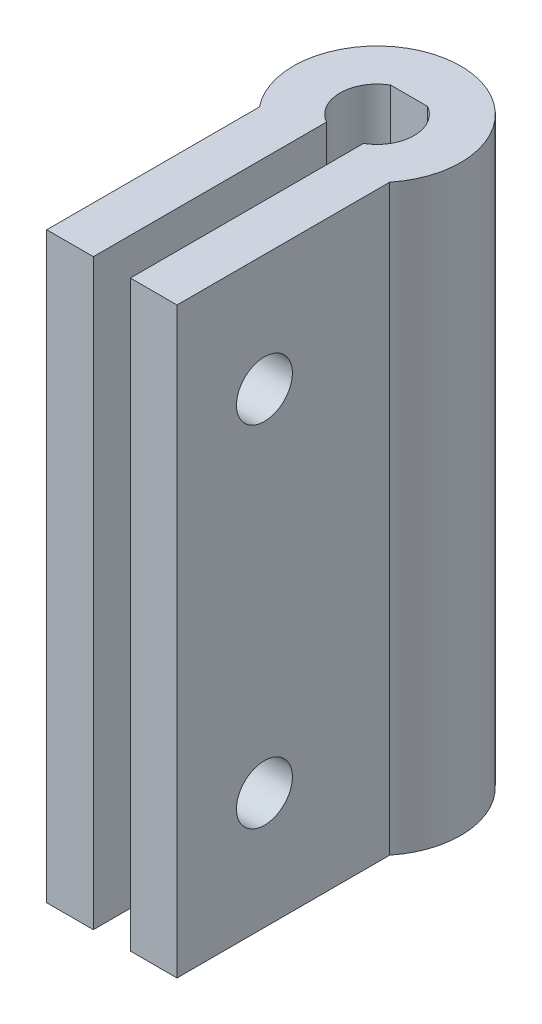
ISO-10303-21;
HEADER;
FILE_DESCRIPTION(('STEP AP214'),'2;1');
FILE_NAME('part.step','',(''),(''),'','','');
FILE_SCHEMA(('AUTOMOTIVE_DESIGN { 1 0 10303 214 1 1 1 1 }'));
ENDSEC;
DATA;
#1=APPLICATION_CONTEXT('core data for automotive mechanical design processes');
#2=APPLICATION_PROTOCOL_DEFINITION('international standard','automotive_design',2000,#1);
#3=PRODUCT_CONTEXT('',#1,'mechanical');
#4=PRODUCT('Part','Part','',(#3));
#5=PRODUCT_RELATED_PRODUCT_CATEGORY('part','',(#4));
#6=PRODUCT_DEFINITION_FORMATION('','',#4);
#7=PRODUCT_DEFINITION_CONTEXT('part definition',#1,'design');
#8=PRODUCT_DEFINITION('design','',#6,#7);
#9=PRODUCT_DEFINITION_SHAPE('','',#8);
#10=(LENGTH_UNIT() NAMED_UNIT(*) SI_UNIT(.MILLI.,.METRE.));
#11=(NAMED_UNIT(*) PLANE_ANGLE_UNIT() SI_UNIT($,.RADIAN.));
#12=(NAMED_UNIT(*) SI_UNIT($,.STERADIAN.) SOLID_ANGLE_UNIT());
#13=UNCERTAINTY_MEASURE_WITH_UNIT(LENGTH_MEASURE(1.E-05),#10,'distance_accuracy_value','');
#14=(GEOMETRIC_REPRESENTATION_CONTEXT(3) GLOBAL_UNCERTAINTY_ASSIGNED_CONTEXT((#13)) GLOBAL_UNIT_ASSIGNED_CONTEXT((#10,
#11,#12)) REPRESENTATION_CONTEXT('',''));
#15=CARTESIAN_POINT('',(0.,0.,0.));
#16=DIRECTION('',(0.,0.,1.));
#17=DIRECTION('',(1.,0.,0.));
#18=AXIS2_PLACEMENT_3D('',#15,#16,#17);
#19=CARTESIAN_POINT('',(0.,50.,0.));
#20=DIRECTION('',(0.,-1.,0.));
#21=DIRECTION('',(0.,0.,-1.));
#22=AXIS2_PLACEMENT_3D('',#19,#20,#21);
#23=CYLINDRICAL_SURFACE('',#22,3.175);
#24=CARTESIAN_POINT('',(0.,0.,0.));
#25=DIRECTION('',(0.,-1.,0.));
#26=DIRECTION('',(0.,0.,1.));
#27=AXIS2_PLACEMENT_3D('',#24,#25,#26);
#28=CIRCLE('',#27,3.175);
#29=CARTESIAN_POINT('',(1.5875,0.,-2.74963065701559));
#30=VERTEX_POINT('',#29);
#31=CARTESIAN_POINT('',(1.5875,0.,2.74963065701559));
#32=VERTEX_POINT('',#31);
#33=EDGE_CURVE('E158',#30,#32,#28,.T.);
#34=ORIENTED_EDGE('',*,*,#33,.T.);
#35=DIRECTION('',(0.,-1.,0.));
#36=VECTOR('',#35,1.);
#37=CARTESIAN_POINT('',(1.5875,50.,2.74963065701559));
#38=LINE('',#37,#36);
#39=CARTESIAN_POINT('',(1.5875,50.,2.74963065701559));
#40=VERTEX_POINT('',#39);
#41=EDGE_CURVE('E11',#40,#32,#38,.T.);
#42=ORIENTED_EDGE('',*,*,#41,.F.);
#43=CARTESIAN_POINT('',(0.,50.,0.));
#44=DIRECTION('',(0.,-1.,0.));
#45=DIRECTION('',(0.,0.,1.));
#46=AXIS2_PLACEMENT_3D('',#43,#44,#45);
#47=CIRCLE('',#46,3.175);
#48=CARTESIAN_POINT('',(1.5875,50.,-2.74963065701559));
#49=VERTEX_POINT('',#48);
#50=EDGE_CURVE('E187',#49,#40,#47,.T.);
#51=ORIENTED_EDGE('',*,*,#50,.F.);
#52=DIRECTION('',(0.,-1.,0.));
#53=VECTOR('',#52,1.);
#54=CARTESIAN_POINT('',(1.5875,50.,-2.74963065701559));
#55=LINE('',#54,#53);
#56=EDGE_CURVE('E154',#49,#30,#55,.T.);
#57=ORIENTED_EDGE('',*,*,#56,.T.);
#58=EDGE_LOOP('',(#34,#42,#51,#57));
#59=FACE_BOUND('',#58,.T.);
#60=ADVANCED_FACE('F43',(#59),#23,.F.);
#61=CARTESIAN_POINT('',(1.5875,50.,2.74963065701559));
#62=DIRECTION('',(1.,0.,0.));
#63=DIRECTION('',(0.,0.,-1.));
#64=AXIS2_PLACEMENT_3D('',#61,#62,#63);
#65=PLANE('',#64);
#66=CARTESIAN_POINT('',(1.5875,40.,15.2496306570156));
#67=DIRECTION('',(1.,0.,0.));
#68=DIRECTION('',(0.,0.,-1.));
#69=AXIS2_PLACEMENT_3D('',#66,#67,#68);
#70=CIRCLE('',#69,2.4);
#71=CARTESIAN_POINT('',(1.5875,40.,12.8496306570156));
#72=VERTEX_POINT('',#71);
#73=EDGE_CURVE('E224',#72,#72,#70,.T.);
#74=ORIENTED_EDGE('',*,*,#73,.T.);
#75=EDGE_LOOP('',(#74));
#76=FACE_BOUND('',#75,.T.);
#77=CARTESIAN_POINT('',(1.5875,10.,15.2496306570156));
#78=DIRECTION('',(1.,0.,0.));
#79=DIRECTION('',(0.,0.,-1.));
#80=AXIS2_PLACEMENT_3D('',#77,#78,#79);
#81=CIRCLE('',#80,2.4);
#82=CARTESIAN_POINT('',(1.5875,10.,12.8496306570156));
#83=VERTEX_POINT('',#82);
#84=EDGE_CURVE('E163',#83,#83,#81,.T.);
#85=ORIENTED_EDGE('',*,*,#84,.T.);
#86=EDGE_LOOP('',(#85));
#87=FACE_BOUND('',#86,.T.);
#88=DIRECTION('',(0.,0.,1.));
#89=VECTOR('',#88,1.);
#90=CARTESIAN_POINT('',(1.5875,0.,2.74963065701559));
#91=LINE('',#90,#89);
#92=CARTESIAN_POINT('',(1.5875,0.,22.7496306570156));
#93=VERTEX_POINT('',#92);
#94=EDGE_CURVE('E162',#32,#93,#91,.T.);
#95=ORIENTED_EDGE('',*,*,#94,.T.);
#96=DIRECTION('',(0.,-1.,0.));
#97=VECTOR('',#96,1.);
#98=CARTESIAN_POINT('',(1.5875,50.,22.7496306570156));
#99=LINE('',#98,#97);
#100=CARTESIAN_POINT('',(1.5875,50.,22.7496306570156));
#101=VERTEX_POINT('',#100);
#102=EDGE_CURVE('E53',#101,#93,#99,.T.);
#103=ORIENTED_EDGE('',*,*,#102,.F.);
#104=DIRECTION('',(0.,0.,1.));
#105=VECTOR('',#104,1.);
#106=CARTESIAN_POINT('',(1.5875,50.,2.74963065701559));
#107=LINE('',#106,#105);
#108=EDGE_CURVE('E111',#40,#101,#107,.T.);
#109=ORIENTED_EDGE('',*,*,#108,.F.);
#110=ORIENTED_EDGE('',*,*,#41,.T.);
#111=EDGE_LOOP('',(#95,#103,#109,#110));
#112=FACE_BOUND('',#111,.T.);
#113=ADVANCED_FACE('F281',(#76,#87,#112),#65,.F.);
#114=CARTESIAN_POINT('',(1.5875,50.,22.7496306570156));
#115=DIRECTION('',(0.,0.,-1.));
#116=DIRECTION('',(-1.,0.,0.));
#117=AXIS2_PLACEMENT_3D('',#114,#115,#116);
#118=PLANE('',#117);
#119=DIRECTION('',(1.,0.,0.));
#120=VECTOR('',#119,1.);
#121=CARTESIAN_POINT('',(1.5875,0.,22.7496306570156));
#122=LINE('',#121,#120);
#123=CARTESIAN_POINT('',(5.5875,0.,22.7496306570156));
#124=VERTEX_POINT('',#123);
#125=EDGE_CURVE('E166',#93,#124,#122,.T.);
#126=ORIENTED_EDGE('',*,*,#125,.T.);
#127=DIRECTION('',(0.,-1.,0.));
#128=VECTOR('',#127,1.);
#129=CARTESIAN_POINT('',(5.5875,50.,22.7496306570156));
#130=LINE('',#129,#128);
#131=CARTESIAN_POINT('',(5.5875,50.,22.7496306570156));
#132=VERTEX_POINT('',#131);
#133=EDGE_CURVE('E206',#132,#124,#130,.T.);
#134=ORIENTED_EDGE('',*,*,#133,.F.);
#135=DIRECTION('',(1.,0.,0.));
#136=VECTOR('',#135,1.);
#137=CARTESIAN_POINT('',(1.5875,50.,22.7496306570156));
#138=LINE('',#137,#136);
#139=EDGE_CURVE('E241',#101,#132,#138,.T.);
#140=ORIENTED_EDGE('',*,*,#139,.F.);
#141=ORIENTED_EDGE('',*,*,#102,.T.);
#142=EDGE_LOOP('',(#126,#134,#140,#141));
#143=FACE_BOUND('',#142,.T.);
#144=ADVANCED_FACE('F285',(#143),#118,.F.);
#145=CARTESIAN_POINT('',(5.5875,50.,4.50116304414759));
#146=DIRECTION('',(-1.,0.,0.));
#147=DIRECTION('',(0.,0.,1.));
#148=AXIS2_PLACEMENT_3D('',#145,#146,#147);
#149=PLANE('',#148);
#150=CARTESIAN_POINT('',(5.5875,40.,15.2496306570156));
#151=DIRECTION('',(1.,0.,0.));
#152=DIRECTION('',(0.,0.,-1.));
#153=AXIS2_PLACEMENT_3D('',#150,#151,#152);
#154=CIRCLE('',#153,2.4);
#155=CARTESIAN_POINT('',(5.5875,40.,12.8496306570156));
#156=VERTEX_POINT('',#155);
#157=EDGE_CURVE('E317',#156,#156,#154,.T.);
#158=ORIENTED_EDGE('',*,*,#157,.F.);
#159=EDGE_LOOP('',(#158));
#160=FACE_BOUND('',#159,.T.);
#161=CARTESIAN_POINT('',(5.5875,10.,15.2496306570156));
#162=DIRECTION('',(1.,0.,0.));
#163=DIRECTION('',(0.,0.,-1.));
#164=AXIS2_PLACEMENT_3D('',#161,#162,#163);
#165=CIRCLE('',#164,2.4);
#166=CARTESIAN_POINT('',(5.5875,10.,12.8496306570156));
#167=VERTEX_POINT('',#166);
#168=EDGE_CURVE('E216',#167,#167,#165,.T.);
#169=ORIENTED_EDGE('',*,*,#168,.F.);
#170=EDGE_LOOP('',(#169));
#171=FACE_BOUND('',#170,.T.);
#172=DIRECTION('',(0.,0.,-1.));
#173=VECTOR('',#172,1.);
#174=CARTESIAN_POINT('',(5.5875,0.,4.50116304414759));
#175=LINE('',#174,#173);
#176=CARTESIAN_POINT('',(5.5875,0.,4.50116304414759));
#177=VERTEX_POINT('',#176);
#178=EDGE_CURVE('E169',#124,#177,#175,.T.);
#179=ORIENTED_EDGE('',*,*,#178,.T.);
#180=DIRECTION('',(0.,-1.,0.));
#181=VECTOR('',#180,1.);
#182=CARTESIAN_POINT('',(5.5875,50.,4.50116304414759));
#183=LINE('',#182,#181);
#184=CARTESIAN_POINT('',(5.5875,50.,4.50116304414759));
#185=VERTEX_POINT('',#184);
#186=EDGE_CURVE('E202',#185,#177,#183,.T.);
#187=ORIENTED_EDGE('',*,*,#186,.F.);
#188=DIRECTION('',(0.,0.,-1.));
#189=VECTOR('',#188,1.);
#190=CARTESIAN_POINT('',(5.5875,50.,4.50116304414759));
#191=LINE('',#190,#189);
#192=EDGE_CURVE('E244',#132,#185,#191,.T.);
#193=ORIENTED_EDGE('',*,*,#192,.F.);
#194=ORIENTED_EDGE('',*,*,#133,.T.);
#195=EDGE_LOOP('',(#179,#187,#193,#194));
#196=FACE_BOUND('',#195,.T.);
#197=ADVANCED_FACE('F290',(#160,#171,#196),#149,.F.);
#198=CARTESIAN_POINT('',(0.,50.,0.));
#199=DIRECTION('',(0.,-1.,0.));
#200=DIRECTION('',(0.,0.,-1.));
#201=AXIS2_PLACEMENT_3D('',#198,#199,#200);
#202=CYLINDRICAL_SURFACE('',#201,7.175);
#203=CARTESIAN_POINT('',(0.,0.,0.));
#204=DIRECTION('',(0.,1.,0.));
#205=DIRECTION('',(0.,0.,1.));
#206=AXIS2_PLACEMENT_3D('',#203,#204,#205);
#207=CIRCLE('',#206,7.175);
#208=CARTESIAN_POINT('',(-5.5875,0.,4.50116304414759));
#209=VERTEX_POINT('',#208);
#210=EDGE_CURVE('E172',#177,#209,#207,.T.);
#211=ORIENTED_EDGE('',*,*,#210,.T.);
#212=DIRECTION('',(0.,-1.,0.));
#213=VECTOR('',#212,1.);
#214=CARTESIAN_POINT('',(-5.5875,50.,4.50116304414759));
#215=LINE('',#214,#213);
#216=CARTESIAN_POINT('',(-5.5875,50.,4.50116304414759));
#217=VERTEX_POINT('',#216);
#218=EDGE_CURVE('E198',#217,#209,#215,.T.);
#219=ORIENTED_EDGE('',*,*,#218,.F.);
#220=CARTESIAN_POINT('',(0.,50.,0.));
#221=DIRECTION('',(0.,1.,0.));
#222=DIRECTION('',(0.,0.,1.));
#223=AXIS2_PLACEMENT_3D('',#220,#221,#222);
#224=CIRCLE('',#223,7.175);
#225=EDGE_CURVE('E247',#185,#217,#224,.T.);
#226=ORIENTED_EDGE('',*,*,#225,.F.);
#227=ORIENTED_EDGE('',*,*,#186,.T.);
#228=EDGE_LOOP('',(#211,#219,#226,#227));
#229=FACE_BOUND('',#228,.T.);
#230=ADVANCED_FACE('F297',(#229),#202,.T.);
#231=CARTESIAN_POINT('',(-5.5875,50.,4.50116304414759));
#232=DIRECTION('',(1.,0.,0.));
#233=DIRECTION('',(0.,0.,-1.));
#234=AXIS2_PLACEMENT_3D('',#231,#232,#233);
#235=PLANE('',#234);
#236=CARTESIAN_POINT('',(-5.5875,40.,15.2496306570156));
#237=DIRECTION('',(1.,0.,0.));
#238=DIRECTION('',(0.,0.,-1.));
#239=AXIS2_PLACEMENT_3D('',#236,#237,#238);
#240=CIRCLE('',#239,2.4);
#241=CARTESIAN_POINT('',(-5.5875,40.,12.8496306570156));
#242=VERTEX_POINT('',#241);
#243=EDGE_CURVE('E46',#242,#242,#240,.T.);
#244=ORIENTED_EDGE('',*,*,#243,.T.);
#245=EDGE_LOOP('',(#244));
#246=FACE_BOUND('',#245,.T.);
#247=CARTESIAN_POINT('',(-5.5875,10.,15.2496306570156));
#248=DIRECTION('',(1.,0.,0.));
#249=DIRECTION('',(0.,0.,-1.));
#250=AXIS2_PLACEMENT_3D('',#247,#248,#249);
#251=CIRCLE('',#250,2.4);
#252=CARTESIAN_POINT('',(-5.5875,10.,12.8496306570156));
#253=VERTEX_POINT('',#252);
#254=EDGE_CURVE('E215',#253,#253,#251,.T.);
#255=ORIENTED_EDGE('',*,*,#254,.T.);
#256=EDGE_LOOP('',(#255));
#257=FACE_BOUND('',#256,.T.);
#258=DIRECTION('',(0.,0.,1.));
#259=VECTOR('',#258,1.);
#260=CARTESIAN_POINT('',(-5.5875,0.,4.50116304414759));
#261=LINE('',#260,#259);
#262=CARTESIAN_POINT('',(-5.5875,0.,22.7496306570156));
#263=VERTEX_POINT('',#262);
#264=EDGE_CURVE('E175',#209,#263,#261,.T.);
#265=ORIENTED_EDGE('',*,*,#264,.T.);
#266=DIRECTION('',(0.,-1.,0.));
#267=VECTOR('',#266,1.);
#268=CARTESIAN_POINT('',(-5.5875,50.,22.7496306570156));
#269=LINE('',#268,#267);
#270=CARTESIAN_POINT('',(-5.5875,50.,22.7496306570156));
#271=VERTEX_POINT('',#270);
#272=EDGE_CURVE('E194',#271,#263,#269,.T.);
#273=ORIENTED_EDGE('',*,*,#272,.F.);
#274=DIRECTION('',(0.,0.,1.));
#275=VECTOR('',#274,1.);
#276=CARTESIAN_POINT('',(-5.5875,50.,4.50116304414759));
#277=LINE('',#276,#275);
#278=EDGE_CURVE('E250',#217,#271,#277,.T.);
#279=ORIENTED_EDGE('',*,*,#278,.F.);
#280=ORIENTED_EDGE('',*,*,#218,.T.);
#281=EDGE_LOOP('',(#265,#273,#279,#280));
#282=FACE_BOUND('',#281,.T.);
#283=ADVANCED_FACE('F258',(#246,#257,#282),#235,.F.);
#284=CARTESIAN_POINT('',(-5.5875,50.,22.7496306570156));
#285=DIRECTION('',(0.,0.,-1.));
#286=DIRECTION('',(-1.,0.,0.));
#287=AXIS2_PLACEMENT_3D('',#284,#285,#286);
#288=PLANE('',#287);
#289=DIRECTION('',(1.,0.,0.));
#290=VECTOR('',#289,1.);
#291=CARTESIAN_POINT('',(-5.5875,0.,22.7496306570156));
#292=LINE('',#291,#290);
#293=CARTESIAN_POINT('',(-1.5875,0.,22.7496306570156));
#294=VERTEX_POINT('',#293);
#295=EDGE_CURVE('E178',#263,#294,#292,.T.);
#296=ORIENTED_EDGE('',*,*,#295,.T.);
#297=DIRECTION('',(0.,-1.,0.));
#298=VECTOR('',#297,1.);
#299=CARTESIAN_POINT('',(-1.5875,50.,22.7496306570156));
#300=LINE('',#299,#298);
#301=CARTESIAN_POINT('',(-1.5875,50.,22.7496306570156));
#302=VERTEX_POINT('',#301);
#303=EDGE_CURVE('E147',#302,#294,#300,.T.);
#304=ORIENTED_EDGE('',*,*,#303,.F.);
#305=DIRECTION('',(1.,0.,0.));
#306=VECTOR('',#305,1.);
#307=CARTESIAN_POINT('',(-5.5875,50.,22.7496306570156));
#308=LINE('',#307,#306);
#309=EDGE_CURVE('E136',#271,#302,#308,.T.);
#310=ORIENTED_EDGE('',*,*,#309,.F.);
#311=ORIENTED_EDGE('',*,*,#272,.T.);
#312=EDGE_LOOP('',(#296,#304,#310,#311));
#313=FACE_BOUND('',#312,.T.);
#314=ADVANCED_FACE('F262',(#313),#288,.F.);
#315=CARTESIAN_POINT('',(-1.5875,50.,2.74963065701559));
#316=DIRECTION('',(-1.,0.,0.));
#317=DIRECTION('',(0.,0.,1.));
#318=AXIS2_PLACEMENT_3D('',#315,#316,#317);
#319=PLANE('',#318);
#320=CARTESIAN_POINT('',(-1.5875,40.,15.2496306570156));
#321=DIRECTION('',(-1.,0.,0.));
#322=DIRECTION('',(0.,0.,1.));
#323=AXIS2_PLACEMENT_3D('',#320,#321,#322);
#324=CIRCLE('',#323,2.4);
#325=CARTESIAN_POINT('',(-1.5875,40.,17.6496306570156));
#326=VERTEX_POINT('',#325);
#327=EDGE_CURVE('E230',#326,#326,#324,.T.);
#328=ORIENTED_EDGE('',*,*,#327,.T.);
#329=EDGE_LOOP('',(#328));
#330=FACE_BOUND('',#329,.T.);
#331=CARTESIAN_POINT('',(-1.5875,10.,15.2496306570156));
#332=DIRECTION('',(-1.,0.,0.));
#333=DIRECTION('',(0.,0.,1.));
#334=AXIS2_PLACEMENT_3D('',#331,#332,#333);
#335=CIRCLE('',#334,2.4);
#336=CARTESIAN_POINT('',(-1.5875,10.,17.6496306570156));
#337=VERTEX_POINT('',#336);
#338=EDGE_CURVE('E212',#337,#337,#335,.T.);
#339=ORIENTED_EDGE('',*,*,#338,.T.);
#340=EDGE_LOOP('',(#339));
#341=FACE_BOUND('',#340,.T.);
#342=DIRECTION('',(0.,0.,-1.));
#343=VECTOR('',#342,1.);
#344=CARTESIAN_POINT('',(-1.5875,0.,2.74963065701559));
#345=LINE('',#344,#343);
#346=CARTESIAN_POINT('',(-1.5875,0.,2.74963065701559));
#347=VERTEX_POINT('',#346);
#348=EDGE_CURVE('E145',#294,#347,#345,.T.);
#349=ORIENTED_EDGE('',*,*,#348,.T.);
#350=DIRECTION('',(0.,-1.,0.));
#351=VECTOR('',#350,1.);
#352=CARTESIAN_POINT('',(-1.5875,50.,2.74963065701559));
#353=LINE('',#352,#351);
#354=CARTESIAN_POINT('',(-1.5875,50.,2.74963065701559));
#355=VERTEX_POINT('',#354);
#356=EDGE_CURVE('E142',#355,#347,#353,.T.);
#357=ORIENTED_EDGE('',*,*,#356,.F.);
#358=DIRECTION('',(0.,0.,-1.));
#359=VECTOR('',#358,1.);
#360=CARTESIAN_POINT('',(-1.5875,50.,2.74963065701559));
#361=LINE('',#360,#359);
#362=EDGE_CURVE('E130',#302,#355,#361,.T.);
#363=ORIENTED_EDGE('',*,*,#362,.F.);
#364=ORIENTED_EDGE('',*,*,#303,.T.);
#365=EDGE_LOOP('',(#349,#357,#363,#364));
#366=FACE_BOUND('',#365,.T.);
#367=ADVANCED_FACE('F143',(#330,#341,#366),#319,.F.);
#368=CARTESIAN_POINT('',(0.,50.,0.));
#369=DIRECTION('',(0.,-1.,0.));
#370=DIRECTION('',(0.,0.,-1.));
#371=AXIS2_PLACEMENT_3D('',#368,#369,#370);
#372=CYLINDRICAL_SURFACE('',#371,3.175);
#373=CARTESIAN_POINT('',(0.,0.,0.));
#374=DIRECTION('',(0.,-1.,0.));
#375=DIRECTION('',(0.,0.,1.));
#376=AXIS2_PLACEMENT_3D('',#373,#374,#375);
#377=CIRCLE('',#376,3.175);
#378=CARTESIAN_POINT('',(-1.5875,0.,-2.74963065701559));
#379=VERTEX_POINT('',#378);
#380=EDGE_CURVE('E97',#347,#379,#377,.T.);
#381=ORIENTED_EDGE('',*,*,#380,.T.);
#382=DIRECTION('',(0.,-1.,0.));
#383=VECTOR('',#382,1.);
#384=CARTESIAN_POINT('',(-1.5875,50.,-2.74963065701559));
#385=LINE('',#384,#383);
#386=CARTESIAN_POINT('',(-1.5875,50.,-2.74963065701559));
#387=VERTEX_POINT('',#386);
#388=EDGE_CURVE('E148',#387,#379,#385,.T.);
#389=ORIENTED_EDGE('',*,*,#388,.F.);
#390=CARTESIAN_POINT('',(0.,50.,0.));
#391=DIRECTION('',(0.,-1.,0.));
#392=DIRECTION('',(0.,0.,1.));
#393=AXIS2_PLACEMENT_3D('',#390,#391,#392);
#394=CIRCLE('',#393,3.175);
#395=EDGE_CURVE('E134',#355,#387,#394,.T.);
#396=ORIENTED_EDGE('',*,*,#395,.F.);
#397=ORIENTED_EDGE('',*,*,#356,.T.);
#398=EDGE_LOOP('',(#381,#389,#396,#397));
#399=FACE_BOUND('',#398,.T.);
#400=ADVANCED_FACE('F150',(#399),#372,.F.);
#401=CARTESIAN_POINT('',(1.5875,50.,-2.74963065701559));
#402=DIRECTION('',(0.,0.,-1.));
#403=DIRECTION('',(-1.,0.,0.));
#404=AXIS2_PLACEMENT_3D('',#401,#402,#403);
#405=PLANE('',#404);
#406=DIRECTION('',(1.,0.,0.));
#407=VECTOR('',#406,1.);
#408=CARTESIAN_POINT('',(1.5875,0.,-2.74963065701559));
#409=LINE('',#408,#407);
#410=EDGE_CURVE('E103',#379,#30,#409,.T.);
#411=ORIENTED_EDGE('',*,*,#410,.T.);
#412=ORIENTED_EDGE('',*,*,#56,.F.);
#413=DIRECTION('',(1.,0.,0.));
#414=VECTOR('',#413,1.);
#415=CARTESIAN_POINT('',(1.5875,50.,-2.74963065701559));
#416=LINE('',#415,#414);
#417=EDGE_CURVE('E62',#387,#49,#416,.T.);
#418=ORIENTED_EDGE('',*,*,#417,.F.);
#419=ORIENTED_EDGE('',*,*,#388,.T.);
#420=EDGE_LOOP('',(#411,#412,#418,#419));
#421=FACE_BOUND('',#420,.T.);
#422=ADVANCED_FACE('F270',(#421),#405,.F.);
#423=CARTESIAN_POINT('',(0.,50.,0.));
#424=DIRECTION('',(0.,1.,0.));
#425=DIRECTION('',(0.,0.,1.));
#426=AXIS2_PLACEMENT_3D('',#423,#424,#425);
#427=PLANE('',#426);
#428=ORIENTED_EDGE('',*,*,#50,.T.);
#429=ORIENTED_EDGE('',*,*,#108,.T.);
#430=ORIENTED_EDGE('',*,*,#139,.T.);
#431=ORIENTED_EDGE('',*,*,#192,.T.);
#432=ORIENTED_EDGE('',*,*,#225,.T.);
#433=ORIENTED_EDGE('',*,*,#278,.T.);
#434=ORIENTED_EDGE('',*,*,#309,.T.);
#435=ORIENTED_EDGE('',*,*,#362,.T.);
#436=ORIENTED_EDGE('',*,*,#395,.T.);
#437=ORIENTED_EDGE('',*,*,#417,.T.);
#438=EDGE_LOOP('',(#428,#429,#430,#431,#432,#433,#434,#435,#436,#437));
#439=FACE_BOUND('',#438,.T.);
#440=ADVANCED_FACE('F132',(#439),#427,.T.);
#441=CARTESIAN_POINT('',(0.,0.,0.));
#442=DIRECTION('',(0.,1.,0.));
#443=DIRECTION('',(0.,0.,1.));
#444=AXIS2_PLACEMENT_3D('',#441,#442,#443);
#445=PLANE('',#444);
#446=ORIENTED_EDGE('',*,*,#33,.F.);
#447=ORIENTED_EDGE('',*,*,#410,.F.);
#448=ORIENTED_EDGE('',*,*,#380,.F.);
#449=ORIENTED_EDGE('',*,*,#348,.F.);
#450=ORIENTED_EDGE('',*,*,#295,.F.);
#451=ORIENTED_EDGE('',*,*,#264,.F.);
#452=ORIENTED_EDGE('',*,*,#210,.F.);
#453=ORIENTED_EDGE('',*,*,#178,.F.);
#454=ORIENTED_EDGE('',*,*,#125,.F.);
#455=ORIENTED_EDGE('',*,*,#94,.F.);
#456=EDGE_LOOP('',(#446,#447,#448,#449,#450,#451,#452,#453,#454,#455));
#457=FACE_BOUND('',#456,.T.);
#458=ADVANCED_FACE('F265',(#457),#445,.F.);
#459=CARTESIAN_POINT('',(5.5875,10.,15.2496306570156));
#460=DIRECTION('',(1.,0.,0.));
#461=DIRECTION('',(0.,0.,-1.));
#462=AXIS2_PLACEMENT_3D('',#459,#460,#461);
#463=CYLINDRICAL_SURFACE('',#462,2.4);
#464=ORIENTED_EDGE('',*,*,#338,.F.);
#465=EDGE_LOOP('',(#464));
#466=FACE_BOUND('',#465,.T.);
#467=ORIENTED_EDGE('',*,*,#254,.F.);
#468=EDGE_LOOP('',(#467));
#469=FACE_BOUND('',#468,.T.);
#470=ADVANCED_FACE('F344',(#466,#469),#463,.F.);
#471=ORIENTED_EDGE('',*,*,#168,.T.);
#472=EDGE_LOOP('',(#471));
#473=FACE_BOUND('',#472,.T.);
#474=ORIENTED_EDGE('',*,*,#84,.F.);
#475=EDGE_LOOP('',(#474));
#476=FACE_BOUND('',#475,.T.);
#477=ADVANCED_FACE('F340',(#473,#476),#463,.F.);
#478=CARTESIAN_POINT('',(5.5875,40.,15.2496306570156));
#479=DIRECTION('',(1.,0.,0.));
#480=DIRECTION('',(0.,0.,-1.));
#481=AXIS2_PLACEMENT_3D('',#478,#479,#480);
#482=CYLINDRICAL_SURFACE('',#481,2.4);
#483=ORIENTED_EDGE('',*,*,#243,.F.);
#484=EDGE_LOOP('',(#483));
#485=FACE_BOUND('',#484,.T.);
#486=ORIENTED_EDGE('',*,*,#327,.F.);
#487=EDGE_LOOP('',(#486));
#488=FACE_BOUND('',#487,.T.);
#489=ADVANCED_FACE('F334',(#485,#488),#482,.F.);
#490=ORIENTED_EDGE('',*,*,#157,.T.);
#491=EDGE_LOOP('',(#490));
#492=FACE_BOUND('',#491,.T.);
#493=ORIENTED_EDGE('',*,*,#73,.F.);
#494=EDGE_LOOP('',(#493));
#495=FACE_BOUND('',#494,.T.);
#496=ADVANCED_FACE('F323',(#492,#495),#482,.F.);
#497=CLOSED_SHELL('',(#60,#113,#144,#197,#230,#283,#314,#367,#400,#422,#440,#458,#470,#477,#489,#496));
#498=MANIFOLD_SOLID_BREP('B2',#497);
#499=ADVANCED_BREP_SHAPE_REPRESENTATION('',(#18,#498),#14);
#500=SHAPE_DEFINITION_REPRESENTATION(#9,#499);
ENDSEC;
END-ISO-10303-21;
